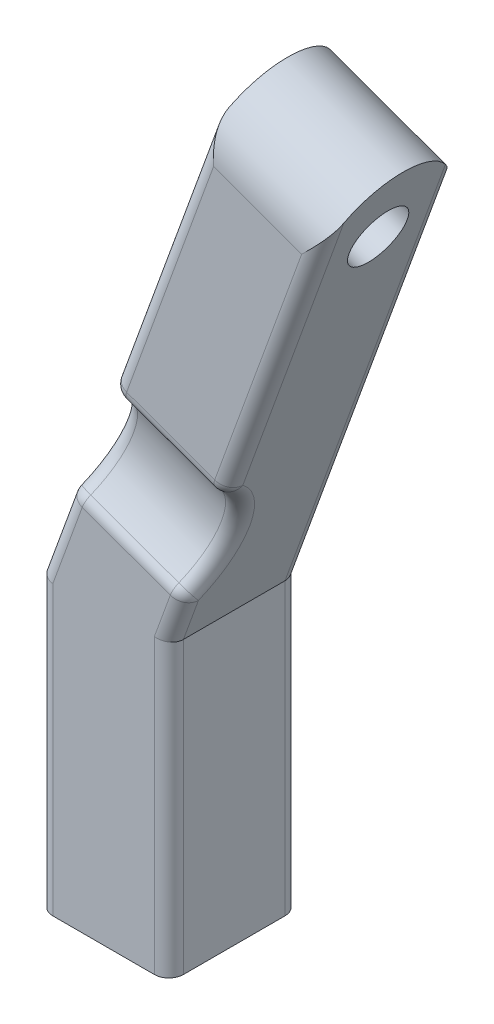
ISO-10303-21;
HEADER;
FILE_DESCRIPTION(('STEP AP214'),'2;1');
FILE_NAME('part.step','',(''),(''),'','','');
FILE_SCHEMA(('AUTOMOTIVE_DESIGN { 1 0 10303 214 1 1 1 1 }'));
ENDSEC;
DATA;
#1=APPLICATION_CONTEXT('core data for automotive mechanical design processes');
#2=APPLICATION_PROTOCOL_DEFINITION('international standard','automotive_design',2000,#1);
#3=PRODUCT_CONTEXT('',#1,'mechanical');
#4=PRODUCT('Part','Part','',(#3));
#5=PRODUCT_RELATED_PRODUCT_CATEGORY('part','',(#4));
#6=PRODUCT_DEFINITION_FORMATION('','',#4);
#7=PRODUCT_DEFINITION_CONTEXT('part definition',#1,'design');
#8=PRODUCT_DEFINITION('design','',#6,#7);
#9=PRODUCT_DEFINITION_SHAPE('','',#8);
#10=(LENGTH_UNIT() NAMED_UNIT(*) SI_UNIT(.MILLI.,.METRE.));
#11=(NAMED_UNIT(*) PLANE_ANGLE_UNIT() SI_UNIT($,.RADIAN.));
#12=(NAMED_UNIT(*) SI_UNIT($,.STERADIAN.) SOLID_ANGLE_UNIT());
#13=UNCERTAINTY_MEASURE_WITH_UNIT(LENGTH_MEASURE(1.E-05),#10,'distance_accuracy_value','');
#14=(GEOMETRIC_REPRESENTATION_CONTEXT(3) GLOBAL_UNCERTAINTY_ASSIGNED_CONTEXT((#13)) GLOBAL_UNIT_ASSIGNED_CONTEXT((#10,
#11,#12)) REPRESENTATION_CONTEXT('',''));
#15=CARTESIAN_POINT('',(0.,0.,0.));
#16=DIRECTION('',(0.,0.,1.));
#17=DIRECTION('',(1.,0.,0.));
#18=AXIS2_PLACEMENT_3D('',#15,#16,#17);
#19=CARTESIAN_POINT('',(0.,0.,9.));
#20=DIRECTION('',(0.,0.,-1.));
#21=DIRECTION('',(-1.,0.,0.));
#22=AXIS2_PLACEMENT_3D('',#19,#20,#21);
#23=PLANE('',#22);
#24=DIRECTION('',(-0.342020143325669,-0.939692620785908,0.));
#25=VECTOR('',#24,1.);
#26=CARTESIAN_POINT('',(-5.4881834760795,1.99753542548456,9.));
#27=LINE('',#26,#25);
#28=CARTESIAN_POINT('',(12.0820868548578,50.2714564134481,9.00000000000001));
#29=VERTEX_POINT('',#28);
#30=CARTESIAN_POINT('',(6.08720428199387,33.8006519122225,9.));
#31=VERTEX_POINT('',#30);
#32=EDGE_CURVE('E239',#29,#31,#27,.T.);
#33=ORIENTED_EDGE('',*,*,#32,.T.);
#34=DIRECTION('',(0.939692620785908,-0.34202014332567,0.));
#35=VECTOR('',#34,1.);
#36=CARTESIAN_POINT('',(11.5753877580734,31.803116486738,9.));
#37=LINE('',#36,#35);
#38=CARTESIAN_POINT('',(12.1550190344574,31.5921479552844,9.));
#39=VERTEX_POINT('',#38);
#40=EDGE_CURVE('E390',#31,#39,#37,.T.);
#41=ORIENTED_EDGE('',*,*,#40,.T.);
#42=DIRECTION('',(0.34202014332567,0.939692620785908,0.));
#43=VECTOR('',#42,1.);
#44=CARTESIAN_POINT('',(0.579631276384077,-0.210968531453531,9.));
#45=LINE('',#44,#43);
#46=CARTESIAN_POINT('',(18.1499016073214,48.06295245651,9.00000000000001));
#47=VERTEX_POINT('',#46);
#48=EDGE_CURVE('E241',#39,#47,#45,.T.);
#49=ORIENTED_EDGE('',*,*,#48,.T.);
#50=DIRECTION('',(0.939692620785908,-0.342020143325669,0.));
#51=VECTOR('',#50,1.);
#52=CARTESIAN_POINT('',(4.99420491631863,52.8512344630694,9.));
#53=LINE('',#52,#51);
#54=EDGE_CURVE('E189',#29,#47,#53,.T.);
#55=ORIENTED_EDGE('',*,*,#54,.F.);
#56=EDGE_LOOP('',(#33,#41,#49,#55));
#57=FACE_BOUND('',#56,.T.);
#58=ADVANCED_FACE('F52',(#57),#23,.F.);
#59=CARTESIAN_POINT('',(0.579631276384081,-0.210968531453532,8.));
#60=DIRECTION('',(0.34202014332567,0.939692620785908,0.));
#61=DIRECTION('',(-0.939692620785908,0.34202014332567,0.));
#62=AXIS2_PLACEMENT_3D('',#59,#60,#61);
#63=CYLINDRICAL_SURFACE('',#62,1.);
#64=ORIENTED_EDGE('',*,*,#48,.F.);
#65=CARTESIAN_POINT('',(12.1550190344574,31.5921479552844,8.));
#66=DIRECTION('',(0.34202014332567,0.939692620785908,0.));
#67=DIRECTION('',(-0.939692620785908,0.34202014332567,0.));
#68=AXIS2_PLACEMENT_3D('',#65,#66,#67);
#69=CIRCLE('',#68,1.);
#70=CARTESIAN_POINT('',(13.0947116552434,31.2501278119588,8.));
#71=VERTEX_POINT('',#70);
#72=EDGE_CURVE('E388',#39,#71,#69,.T.);
#73=ORIENTED_EDGE('',*,*,#72,.T.);
#74=DIRECTION('',(0.34202014332567,0.939692620785908,0.));
#75=VECTOR('',#74,1.);
#76=CARTESIAN_POINT('',(20.6286848730728,51.9495491067209,8.));
#77=LINE('',#76,#75);
#78=CARTESIAN_POINT('',(20.0569732786992,50.378784410739,8.));
#79=VERTEX_POINT('',#78);
#80=EDGE_CURVE('E255',#79,#71,#77,.F.);
#81=ORIENTED_EDGE('',*,*,#80,.F.);
#82=CARTESIAN_POINT('',(20.0569732786992,50.378784410739,8.));
#83=CARTESIAN_POINT('',(20.0377970741125,50.32618437219,8.04525694932147));
#84=CARTESIAN_POINT('',(20.0154365664339,50.2736362015838,8.08910814539003));
#85=CARTESIAN_POINT('',(19.9653490970672,50.1687947661599,8.17373460352773));
#86=CARTESIAN_POINT('',(19.93763247312,50.1165012061111,8.21451558398623));
#87=CARTESIAN_POINT('',(19.8779757189125,50.012504670552,8.2926216928425));
#88=CARTESIAN_POINT('',(19.846068336757,49.9608001873787,8.32997014684788));
#89=CARTESIAN_POINT('',(19.778573462846,49.8575732697211,8.40152630474944));
#90=CARTESIAN_POINT('',(19.7429835574295,49.8060509778213,8.43573192063235));
#91=CARTESIAN_POINT('',(19.6465207030887,49.6724173046542,8.52051490694975));
#92=CARTESIAN_POINT('',(19.5832662995524,49.5904574563704,8.56863531736414));
#93=CARTESIAN_POINT('',(19.4509043475849,49.4270032411482,8.6569408326271));
#94=CARTESIAN_POINT('',(19.3817945240321,49.3455090683974,8.69712283261816));
#95=CARTESIAN_POINT('',(19.2388918225493,49.1825598020291,8.76992408041401));
#96=CARTESIAN_POINT('',(19.1650795437087,49.1011064829517,8.80250901476742));
#97=CARTESIAN_POINT('',(19.0142604341818,48.9385477876584,8.86009231370487));
#98=CARTESIAN_POINT('',(18.9372544102339,48.8574423292161,8.88509258106378));
#99=CARTESIAN_POINT('',(18.7454791596055,48.6586448978246,8.93739310974829));
#100=CARTESIAN_POINT('',(18.6294504498062,48.5410745716638,8.96057647342611));
#101=CARTESIAN_POINT('',(18.3954082443717,48.3064478384059,8.99165072996591));
#102=CARTESIAN_POINT('',(18.2774002358325,48.1893908762592,8.99957852108625));
#103=CARTESIAN_POINT('',(18.156252492378,48.0692504910018,8.99999454091727));
#104=CARTESIAN_POINT('',(18.1530770255399,48.0661014504405,8.99999999503801));
#105=CARTESIAN_POINT('',(18.1499016073213,48.0629524565099,9.));
#106=B_SPLINE_CURVE_WITH_KNOTS('',3,(#82,#83,#84,#85,#86,#87,#88,#89,#90,#91,#92,#93,#94,#95,
#96,#97,#98,#99,#100,#101,#102,#103,#104,#105),.UNSPECIFIED.,.F.,.F.,(4,2,2,2,2,2,2,2,2,2,2,4),
(0.,0.21578260692182,0.431152822075384,0.644930394770693,0.85884898354414,1.20082332099111,
1.54293114720833,1.8865554568414,2.23009348959458,2.72973479565725,3.22816610576653,
3.24158252361186),.UNSPECIFIED.);
#107=EDGE_CURVE('E184',#79,#47,#106,.T.);
#108=ORIENTED_EDGE('',*,*,#107,.T.);
#109=EDGE_LOOP('',(#64,#73,#81,#108));
#110=FACE_BOUND('',#109,.T.);
#111=ADVANCED_FACE('F331',(#110),#63,.T.);
#112=CARTESIAN_POINT('',(-5.4881834760795,1.99753542548456,8.));
#113=DIRECTION('',(-0.342020143325669,-0.939692620785908,0.));
#114=DIRECTION('',(0.939692620785908,-0.342020143325669,0.));
#115=AXIS2_PLACEMENT_3D('',#112,#113,#114);
#116=CYLINDRICAL_SURFACE('',#115,1.);
#117=CARTESIAN_POINT('',(3.0280831213922,25.3957856000936,9.));
#118=VERTEX_POINT('',#117);
#119=CARTESIAN_POINT('',(1.,19.8236730192915,9.));
#120=VERTEX_POINT('',#119);
#121=EDGE_CURVE('E238',#118,#120,#27,.T.);
#122=ORIENTED_EDGE('',*,*,#121,.F.);
#123=CARTESIAN_POINT('',(3.0280831213922,25.3957856000936,8.));
#124=DIRECTION('',(-0.342020143325669,-0.939692620785908,0.));
#125=DIRECTION('',(0.939692620785908,-0.342020143325669,0.));
#126=AXIS2_PLACEMENT_3D('',#123,#124,#125);
#127=CIRCLE('',#126,1.);
#128=CARTESIAN_POINT('',(2.08839050060629,25.7378057434193,8.));
#129=VERTEX_POINT('',#128);
#130=EDGE_CURVE('E373',#118,#129,#127,.T.);
#131=ORIENTED_EDGE('',*,*,#130,.T.);
#132=DIRECTION('',(-0.342020143325669,-0.939692620785908,0.));
#133=VECTOR('',#132,1.);
#134=CARTESIAN_POINT('',(0.,20.,8.));
#135=LINE('',#134,#133);
#136=CARTESIAN_POINT('',(0.,20.,8.));
#137=VERTEX_POINT('',#136);
#138=EDGE_CURVE('E258',#137,#129,#135,.F.);
#139=ORIENTED_EDGE('',*,*,#138,.F.);
#140=CARTESIAN_POINT('',(0.999999999999999,19.8236730192915,8.));
#141=DIRECTION('',(-0.173648177666931,-0.984807753012208,0.));
#142=DIRECTION('',(0.984807753012208,-0.173648177666931,0.));
#143=AXIS2_PLACEMENT_3D('',#140,#141,#142);
#144=ELLIPSE('',#143,1.01542661188575,1.);
#145=EDGE_CURVE('E264',#137,#120,#144,.F.);
#146=ORIENTED_EDGE('',*,*,#145,.T.);
#147=EDGE_LOOP('',(#122,#131,#139,#146));
#148=FACE_BOUND('',#147,.T.);
#149=ADVANCED_FACE('F290',(#148),#116,.T.);
#150=CARTESIAN_POINT('',(20.6286848730728,51.9495491067209,9.));
#151=DIRECTION('',(-0.939692620785908,0.34202014332567,0.));
#152=DIRECTION('',(-0.34202014332567,-0.939692620785908,0.));
#153=AXIS2_PLACEMENT_3D('',#150,#151,#152);
#154=PLANE('',#153);
#155=CARTESIAN_POINT('',(18.9185841564444,47.2510860027914,4.5));
#156=DIRECTION('',(-0.939692620785908,0.34202014332567,0.));
#157=DIRECTION('',(-0.34202014332567,-0.939692620785908,0.));
#158=AXIS2_PLACEMENT_3D('',#155,#156,#157);
#159=CIRCLE('',#158,2.);
#160=CARTESIAN_POINT('',(18.2345438697931,45.3717007612196,4.5));
#161=VERTEX_POINT('',#160);
#162=EDGE_CURVE('E409',#161,#161,#159,.T.);
#163=ORIENTED_EDGE('',*,*,#162,.T.);
#164=EDGE_LOOP('',(#163));
#165=FACE_BOUND('',#164,.T.);
#166=ORIENTED_EDGE('',*,*,#80,.T.);
#167=CARTESIAN_POINT('',(11.5651510749425,27.0476946558943,12.));
#168=DIRECTION('',(-0.939692620785908,0.34202014332567,0.));
#169=DIRECTION('',(-0.34202014332567,-0.939692620785908,0.));
#170=AXIS2_PLACEMENT_3D('',#167,#168,#169);
#171=CIRCLE('',#170,6.);
#172=CARTESIAN_POINT('',(10.0355904946417,22.8452614998299,8.));
#173=VERTEX_POINT('',#172);
#174=EDGE_CURVE('E386',#71,#173,#171,.T.);
#175=ORIENTED_EDGE('',*,*,#174,.T.);
#176=CARTESIAN_POINT('',(9.,20.,8.));
#177=VERTEX_POINT('',#176);
#178=EDGE_CURVE('E254',#173,#177,#77,.F.);
#179=ORIENTED_EDGE('',*,*,#178,.T.);
#180=DIRECTION('',(0.,0.,-1.));
#181=VECTOR('',#180,1.);
#182=CARTESIAN_POINT('',(9.,20.,9.));
#183=LINE('',#182,#181);
#184=CARTESIAN_POINT('',(9.,20.,0.999999999999999));
#185=VERTEX_POINT('',#184);
#186=EDGE_CURVE('E202',#177,#185,#183,.T.);
#187=ORIENTED_EDGE('',*,*,#186,.T.);
#188=DIRECTION('',(0.34202014332567,0.939692620785908,0.));
#189=VECTOR('',#188,1.);
#190=CARTESIAN_POINT('',(20.6286848730728,51.9495491067209,0.999999999999999));
#191=LINE('',#190,#189);
#192=CARTESIAN_POINT('',(20.0569732786992,50.378784410739,0.999999999999999));
#193=VERTEX_POINT('',#192);
#194=EDGE_CURVE('E196',#185,#193,#191,.T.);
#195=ORIENTED_EDGE('',*,*,#194,.T.);
#196=CARTESIAN_POINT('',(19.0895942281073,47.7209323131843,4.5));
#197=DIRECTION('',(0.939692620785908,-0.34202014332567,0.));
#198=DIRECTION('',(0.34202014332567,0.939692620785908,0.));
#199=AXIS2_PLACEMENT_3D('',#196,#197,#198);
#200=CIRCLE('',#199,4.5);
#201=EDGE_CURVE('E177',#193,#79,#200,.T.);
#202=ORIENTED_EDGE('',*,*,#201,.T.);
#203=EDGE_LOOP('',(#166,#175,#179,#187,#195,#202));
#204=FACE_BOUND('',#203,.T.);
#205=ADVANCED_FACE('F200',(#165,#204),#154,.F.);
#206=CARTESIAN_POINT('',(0.,20.,9.));
#207=DIRECTION('',(0.939692620785908,-0.342020143325669,0.));
#208=DIRECTION('',(0.342020143325669,0.939692620785908,0.));
#209=AXIS2_PLACEMENT_3D('',#206,#207,#208);
#210=PLANE('',#209);
#211=CARTESIAN_POINT('',(10.971384162409,50.1436302463808,4.5));
#212=DIRECTION('',(-0.939692620785908,0.342020143325669,0.));
#213=DIRECTION('',(-0.342020143325669,-0.939692620785908,0.));
#214=AXIS2_PLACEMENT_3D('',#211,#212,#213);
#215=CIRCLE('',#214,2.);
#216=CARTESIAN_POINT('',(10.2873438757577,48.264245004809,4.5));
#217=VERTEX_POINT('',#216);
#218=EDGE_CURVE('E405',#217,#217,#215,.T.);
#219=ORIENTED_EDGE('',*,*,#218,.F.);
#220=EDGE_LOOP('',(#219));
#221=FACE_BOUND('',#220,.T.);
#222=ORIENTED_EDGE('',*,*,#138,.T.);
#223=CARTESIAN_POINT('',(3.61795108090713,29.9402388994838,12.));
#224=DIRECTION('',(0.939692620785908,-0.342020143325669,0.));
#225=DIRECTION('',(0.342020143325669,0.939692620785908,0.));
#226=AXIS2_PLACEMENT_3D('',#223,#224,#225);
#227=CIRCLE('',#226,6.);
#228=CARTESIAN_POINT('',(5.14751166120796,34.1426720555482,8.));
#229=VERTEX_POINT('',#228);
#230=EDGE_CURVE('E12',#129,#229,#227,.T.);
#231=ORIENTED_EDGE('',*,*,#230,.T.);
#232=CARTESIAN_POINT('',(12.1097732846638,53.2713286543284,8.));
#233=VERTEX_POINT('',#232);
#234=EDGE_CURVE('E257',#229,#233,#135,.F.);
#235=ORIENTED_EDGE('',*,*,#234,.T.);
#236=CARTESIAN_POINT('',(11.1423942340719,50.6134765567737,4.5));
#237=DIRECTION('',(0.939692620785908,-0.342020143325669,0.));
#238=DIRECTION('',(0.342020143325669,0.939692620785908,0.));
#239=AXIS2_PLACEMENT_3D('',#236,#237,#238);
#240=CIRCLE('',#239,4.5);
#241=CARTESIAN_POINT('',(12.1097732846638,53.2713286543284,1.));
#242=VERTEX_POINT('',#241);
#243=EDGE_CURVE('E650',#242,#233,#240,.T.);
#244=ORIENTED_EDGE('',*,*,#243,.F.);
#245=DIRECTION('',(-0.342020143325669,-0.939692620785908,0.));
#246=VECTOR('',#245,1.);
#247=CARTESIAN_POINT('',(0.,20.,0.999999999999999));
#248=LINE('',#247,#246);
#249=CARTESIAN_POINT('',(0.,20.,0.999999999999999));
#250=VERTEX_POINT('',#249);
#251=EDGE_CURVE('E217',#242,#250,#248,.T.);
#252=ORIENTED_EDGE('',*,*,#251,.T.);
#253=DIRECTION('',(0.,0.,-1.));
#254=VECTOR('',#253,1.);
#255=CARTESIAN_POINT('',(0.,20.,9.));
#256=LINE('',#255,#254);
#257=EDGE_CURVE('E451',#137,#250,#256,.T.);
#258=ORIENTED_EDGE('',*,*,#257,.F.);
#259=EDGE_LOOP('',(#222,#231,#235,#244,#252,#258));
#260=FACE_BOUND('',#259,.T.);
#261=ADVANCED_FACE('F492',(#221,#260),#210,.F.);
#262=CARTESIAN_POINT('',(0.,0.,0.));
#263=DIRECTION('',(0.,0.,-1.));
#264=DIRECTION('',(-1.,0.,0.));
#265=AXIS2_PLACEMENT_3D('',#262,#263,#264);
#266=PLANE('',#265);
#267=DIRECTION('',(-0.342020143325669,-0.939692620785908,0.));
#268=VECTOR('',#267,1.);
#269=CARTESIAN_POINT('',(13.6211774998233,54.5000732069846,0.));
#270=LINE('',#269,#268);
#271=CARTESIAN_POINT('',(1.,19.8236730192915,0.));
#272=VERTEX_POINT('',#271);
#273=CARTESIAN_POINT('',(12.0820868548578,50.2714564134481,0.));
#274=VERTEX_POINT('',#273);
#275=EDGE_CURVE('E207',#272,#274,#270,.F.);
#276=ORIENTED_EDGE('',*,*,#275,.T.);
#277=DIRECTION('',(0.939692620785908,-0.342020143325669,0.));
#278=VECTOR('',#277,1.);
#279=CARTESIAN_POINT('',(4.99420491631864,52.8512344630694,0.));
#280=LINE('',#279,#278);
#281=CARTESIAN_POINT('',(18.1499016073213,48.06295245651,0.));
#282=VERTEX_POINT('',#281);
#283=EDGE_CURVE('E198',#274,#282,#280,.T.);
#284=ORIENTED_EDGE('',*,*,#283,.T.);
#285=DIRECTION('',(0.34202014332567,0.939692620785908,0.));
#286=VECTOR('',#285,1.);
#287=CARTESIAN_POINT('',(8.06030737921409,20.3420201433257,0.));
#288=LINE('',#287,#286);
#289=CARTESIAN_POINT('',(8.,20.1763269807085,0.));
#290=VERTEX_POINT('',#289);
#291=EDGE_CURVE('E197',#282,#290,#288,.F.);
#292=ORIENTED_EDGE('',*,*,#291,.T.);
#293=DIRECTION('',(0.,1.,0.));
#294=VECTOR('',#293,1.);
#295=CARTESIAN_POINT('',(8.,0.,0.));
#296=LINE('',#295,#294);
#297=CARTESIAN_POINT('',(8.,0.,0.));
#298=VERTEX_POINT('',#297);
#299=EDGE_CURVE('E214',#290,#298,#296,.F.);
#300=ORIENTED_EDGE('',*,*,#299,.T.);
#301=DIRECTION('',(1.,0.,0.));
#302=VECTOR('',#301,1.);
#303=CARTESIAN_POINT('',(9.,0.,0.));
#304=LINE('',#303,#302);
#305=CARTESIAN_POINT('',(0.999999999999999,0.,0.));
#306=VERTEX_POINT('',#305);
#307=EDGE_CURVE('E449',#306,#298,#304,.T.);
#308=ORIENTED_EDGE('',*,*,#307,.F.);
#309=DIRECTION('',(0.,-1.,0.));
#310=VECTOR('',#309,1.);
#311=CARTESIAN_POINT('',(1.,20.,0.));
#312=LINE('',#311,#310);
#313=EDGE_CURVE('E204',#306,#272,#312,.F.);
#314=ORIENTED_EDGE('',*,*,#313,.T.);
#315=EDGE_LOOP('',(#276,#284,#292,#300,#308,#314));
#316=FACE_BOUND('',#315,.T.);
#317=ADVANCED_FACE('F425',(#316),#266,.T.);
#318=CARTESIAN_POINT('',(19.6889922522869,52.2915692500465,0.999999999999999));
#319=DIRECTION('',(-0.34202014332567,-0.939692620785908,0.));
#320=DIRECTION('',(0.939692620785908,-0.34202014332567,0.));
#321=AXIS2_PLACEMENT_3D('',#318,#319,#320);
#322=CYLINDRICAL_SURFACE('',#321,1.);
#323=ORIENTED_EDGE('',*,*,#291,.F.);
#324=CARTESIAN_POINT('',(20.0569732786992,50.378784410739,0.999999999999999));
#325=CARTESIAN_POINT('',(20.0377970741125,50.32618437219,0.954743050678535));
#326=CARTESIAN_POINT('',(20.0154365664339,50.2736362015838,0.91089185460998));
#327=CARTESIAN_POINT('',(19.9653490970672,50.1687947661599,0.826265396472295));
#328=CARTESIAN_POINT('',(19.9376324731201,50.1165012061112,0.785484416013793));
#329=CARTESIAN_POINT('',(19.8779757189125,50.012504670552,0.707378307157524));
#330=CARTESIAN_POINT('',(19.846068336757,49.9608001873787,0.670029853152142));
#331=CARTESIAN_POINT('',(19.778573462846,49.8575732697211,0.598473695250576));
#332=CARTESIAN_POINT('',(19.7429835574295,49.8060509778213,0.564268079367651));
#333=CARTESIAN_POINT('',(19.6465207030886,49.6724173046542,0.479485093050242));
#334=CARTESIAN_POINT('',(19.5832662995524,49.5904574563704,0.431364682635849));
#335=CARTESIAN_POINT('',(19.4509043475848,49.4270032411482,0.343059167372885));
#336=CARTESIAN_POINT('',(19.3817945240321,49.3455090683974,0.302877167381828));
#337=CARTESIAN_POINT('',(19.2388918225492,49.182559802029,0.230075919585977));
#338=CARTESIAN_POINT('',(19.1650795437087,49.1011064829517,0.197490985232567));
#339=CARTESIAN_POINT('',(19.0142604341818,48.9385477876584,0.139907686295121));
#340=CARTESIAN_POINT('',(18.9372544102339,48.8574423292162,0.114907418936209));
#341=CARTESIAN_POINT('',(18.7454791596056,48.6586448978246,0.0626068902517147));
#342=CARTESIAN_POINT('',(18.6294504498064,48.5410745716636,0.0394235265738949));
#343=CARTESIAN_POINT('',(18.3954082443715,48.3064478384062,0.00834927003408484));
#344=CARTESIAN_POINT('',(18.2774002358315,48.1893908762602,0.000421478913736042));
#345=CARTESIAN_POINT('',(18.156252492378,48.0692504910019,5.45908272978795E-06));
#346=CARTESIAN_POINT('',(18.1530770255399,48.0661014504406,4.96199342688373E-09));
#347=CARTESIAN_POINT('',(18.1499016073214,48.06295245651,0.));
#348=B_SPLINE_CURVE_WITH_KNOTS('',3,(#324,#325,#326,#327,#328,#329,#330,#331,#332,#333,#334,
#335,#336,#337,#338,#339,#340,#341,#342,#343,#344,#345,#346,#347),.UNSPECIFIED.,.F.,.F.,(4,2,2,
2,2,2,2,2,2,2,2,4),(0.,0.215782606921787,0.431152822075316,0.64493039477065,0.858848983544129,
1.20082332099112,1.54293114720838,1.88655545684142,2.23009348959458,2.7297347956572,
3.22816610576645,3.24158252361179),.UNSPECIFIED.);
#349=EDGE_CURVE('E180',#282,#193,#348,.F.);
#350=ORIENTED_EDGE('',*,*,#349,.T.);
#351=ORIENTED_EDGE('',*,*,#194,.F.);
#352=CARTESIAN_POINT('',(8.,20.1763269807085,0.999999999999999));
#353=DIRECTION('',(-0.173648177666931,-0.984807753012208,0.));
#354=DIRECTION('',(-0.984807753012208,0.17364817766693,0.));
#355=AXIS2_PLACEMENT_3D('',#352,#353,#354);
#356=ELLIPSE('',#355,1.01542661188575,1.);
#357=EDGE_CURVE('E230',#185,#290,#356,.F.);
#358=ORIENTED_EDGE('',*,*,#357,.T.);
#359=EDGE_LOOP('',(#323,#350,#351,#358));
#360=FACE_BOUND('',#359,.T.);
#361=ADVANCED_FACE('F194',(#360),#322,.T.);
#362=CARTESIAN_POINT('',(0.939692620785908,19.6579798566743,0.999999999999999));
#363=DIRECTION('',(0.342020143325669,0.939692620785908,0.));
#364=DIRECTION('',(-0.939692620785908,0.342020143325669,0.));
#365=AXIS2_PLACEMENT_3D('',#362,#363,#364);
#366=CYLINDRICAL_SURFACE('',#365,1.);
#367=ORIENTED_EDGE('',*,*,#251,.F.);
#368=CARTESIAN_POINT('',(12.1097732846638,53.2713286543284,0.999999999999999));
#369=CARTESIAN_POINT('',(12.0906524565791,53.218708460381,0.95474305067854));
#370=CARTESIAN_POINT('',(12.0740042862543,53.16408116901,0.910891854609987));
#371=CARTESIAN_POINT('',(12.0449827381603,53.0515723652854,0.826265396472305));
#372=CARTESIAN_POINT('',(12.0326012514513,52.9936972717436,0.785484416013805));
#373=CARTESIAN_POINT('',(12.0114532919988,52.8756846811362,0.707378307157531));
#374=CARTESIAN_POINT('',(12.0026607636444,52.8155670792098,0.670029853152144));
#375=CARTESIAN_POINT('',(11.9880118530865,52.6931058038906,0.598473695250572));
#376=CARTESIAN_POINT('',(11.9821574115061,52.6307606882523,0.564268079367646));
#377=CARTESIAN_POINT('',(11.9701541756926,52.4663862279437,0.479485093050234));
#378=CARTESIAN_POINT('',(11.9659270850557,52.3629421947559,0.43136468263584));
#379=CARTESIAN_POINT('',(11.962255878545,52.1526483787618,0.343059167372875));
#380=CARTESIAN_POINT('',(11.9628136303366,52.0457972822922,0.302877167381817));
#381=CARTESIAN_POINT('',(11.9675416812852,51.8291148163765,0.230075919585967));
#382=CARTESIAN_POINT('',(11.9717279830542,51.7192723356422,0.197490985232558));
#383=CARTESIAN_POINT('',(11.9827714086421,51.4978004955243,0.139907686295113));
#384=CARTESIAN_POINT('',(11.9896278616095,51.3861715917131,0.114907418936201));
#385=CARTESIAN_POINT('',(12.0087517009449,51.1106131691408,0.062606890251709));
#386=CARTESIAN_POINT('',(12.0220621004056,50.9459672570827,0.0394235265738902));
#387=CARTESIAN_POINT('',(12.0505336742956,50.6157933220665,0.00834927003408772));
#388=CARTESIAN_POINT('',(12.0656902885867,50.4502684009529,0.000421478913745622));
#389=CARTESIAN_POINT('',(12.0812700931881,50.2803632579982,5.45908272928744E-06));
#390=CARTESIAN_POINT('',(12.0816784776584,50.2759098022365,4.96199264969782E-09));
#391=CARTESIAN_POINT('',(12.0820868548578,50.2714564134481,0.));
#392=B_SPLINE_CURVE_WITH_KNOTS('',3,(#368,#369,#370,#371,#372,#373,#374,#375,#376,#377,#378,
#379,#380,#381,#382,#383,#384,#385,#386,#387,#388,#389,#390,#391),.UNSPECIFIED.,.F.,.F.,(4,2,2,
2,2,2,2,2,2,2,2,4),(0.,0.215782606921785,0.431152822075306,0.644930394770661,0.858848983544151,
1.20082332099116,1.54293114720842,1.88655545684146,2.23009348959463,2.72973479565722,
3.22816610576645,3.24158252361177),.UNSPECIFIED.);
#393=EDGE_CURVE('E274',#242,#274,#392,.T.);
#394=ORIENTED_EDGE('',*,*,#393,.T.);
#395=ORIENTED_EDGE('',*,*,#275,.F.);
#396=CARTESIAN_POINT('',(1.,19.8236730192915,0.999999999999999));
#397=DIRECTION('',(0.173648177666931,0.984807753012208,0.));
#398=DIRECTION('',(-0.984807753012208,0.173648177666931,0.));
#399=AXIS2_PLACEMENT_3D('',#396,#397,#398);
#400=ELLIPSE('',#399,1.01542661188575,1.);
#401=EDGE_CURVE('E233',#272,#250,#400,.T.);
#402=ORIENTED_EDGE('',*,*,#401,.T.);
#403=EDGE_LOOP('',(#367,#394,#395,#402));
#404=FACE_BOUND('',#403,.T.);
#405=ADVANCED_FACE('F342',(#404),#366,.T.);
#406=CARTESIAN_POINT('',(8.,20.1763269807085,9.));
#407=VERTEX_POINT('',#406);
#408=CARTESIAN_POINT('',(9.09589787385577,23.1872816431555,9.));
#409=VERTEX_POINT('',#408);
#410=EDGE_CURVE('E242',#407,#409,#45,.T.);
#411=ORIENTED_EDGE('',*,*,#410,.T.);
#412=DIRECTION('',(0.939692620785908,-0.34202014332567,0.));
#413=VECTOR('',#412,1.);
#414=CARTESIAN_POINT('',(8.5162665974717,23.3982501746091,9.));
#415=LINE('',#414,#413);
#416=EDGE_CURVE('E353',#409,#118,#415,.F.);
#417=ORIENTED_EDGE('',*,*,#416,.T.);
#418=ORIENTED_EDGE('',*,*,#121,.T.);
#419=DIRECTION('',(0.,-1.,0.));
#420=VECTOR('',#419,1.);
#421=CARTESIAN_POINT('',(1.,0.,9.));
#422=LINE('',#421,#420);
#423=CARTESIAN_POINT('',(0.999999999999999,0.,9.));
#424=VERTEX_POINT('',#423);
#425=EDGE_CURVE('E229',#120,#424,#422,.T.);
#426=ORIENTED_EDGE('',*,*,#425,.T.);
#427=DIRECTION('',(1.,0.,0.));
#428=VECTOR('',#427,1.);
#429=CARTESIAN_POINT('',(9.,0.,9.));
#430=LINE('',#429,#428);
#431=CARTESIAN_POINT('',(8.,0.,9.));
#432=VERTEX_POINT('',#431);
#433=EDGE_CURVE('E445',#424,#432,#430,.T.);
#434=ORIENTED_EDGE('',*,*,#433,.T.);
#435=DIRECTION('',(0.,1.,0.));
#436=VECTOR('',#435,1.);
#437=CARTESIAN_POINT('',(8.,0.,9.));
#438=LINE('',#437,#436);
#439=EDGE_CURVE('E245',#432,#407,#438,.T.);
#440=ORIENTED_EDGE('',*,*,#439,.T.);
#441=EDGE_LOOP('',(#411,#417,#418,#426,#434,#440));
#442=FACE_BOUND('',#441,.T.);
#443=ADVANCED_FACE('F334',(#442),#23,.F.);
#444=ORIENTED_EDGE('',*,*,#178,.F.);
#445=CARTESIAN_POINT('',(9.09589787385577,23.1872816431555,8.));
#446=DIRECTION('',(0.34202014332567,0.939692620785908,0.));
#447=DIRECTION('',(-0.939692620785908,0.34202014332567,0.));
#448=AXIS2_PLACEMENT_3D('',#445,#446,#447);
#449=CIRCLE('',#448,1.);
#450=EDGE_CURVE('E361',#173,#409,#449,.F.);
#451=ORIENTED_EDGE('',*,*,#450,.T.);
#452=ORIENTED_EDGE('',*,*,#410,.F.);
#453=CARTESIAN_POINT('',(8.,20.1763269807085,8.));
#454=DIRECTION('',(0.173648177666931,0.984807753012208,0.));
#455=DIRECTION('',(-0.984807753012208,0.17364817766693,0.));
#456=AXIS2_PLACEMENT_3D('',#453,#454,#455);
#457=ELLIPSE('',#456,1.01542661188575,1.);
#458=EDGE_CURVE('E236',#177,#407,#457,.F.);
#459=ORIENTED_EDGE('',*,*,#458,.F.);
#460=EDGE_LOOP('',(#444,#451,#452,#459));
#461=FACE_BOUND('',#460,.T.);
#462=ADVANCED_FACE('F289',(#461),#63,.T.);
#463=ORIENTED_EDGE('',*,*,#234,.F.);
#464=CARTESIAN_POINT('',(6.08720428199386,33.8006519122225,8.));
#465=DIRECTION('',(-0.342020143325669,-0.939692620785908,0.));
#466=DIRECTION('',(0.939692620785908,-0.342020143325669,0.));
#467=AXIS2_PLACEMENT_3D('',#464,#465,#466);
#468=CIRCLE('',#467,1.);
#469=EDGE_CURVE('E61',#229,#31,#468,.F.);
#470=ORIENTED_EDGE('',*,*,#469,.T.);
#471=ORIENTED_EDGE('',*,*,#32,.F.);
#472=CARTESIAN_POINT('',(12.1097732846638,53.2713286543285,8.));
#473=CARTESIAN_POINT('',(12.0906524565791,53.218708460381,8.04525694932147));
#474=CARTESIAN_POINT('',(12.0740042862543,53.16408116901,8.08910814539003));
#475=CARTESIAN_POINT('',(12.0449827381603,53.0515723652854,8.17373460352773));
#476=CARTESIAN_POINT('',(12.0326012514513,52.9936972717435,8.21451558398624));
#477=CARTESIAN_POINT('',(12.0114532919988,52.8756846811361,8.29262169284251));
#478=CARTESIAN_POINT('',(12.0026607636444,52.8155670792097,8.32997014684789));
#479=CARTESIAN_POINT('',(11.9880118530865,52.6931058038905,8.40152630474944));
#480=CARTESIAN_POINT('',(11.9821574115061,52.6307606882523,8.43573192063236));
#481=CARTESIAN_POINT('',(11.9701541756926,52.4663862279438,8.52051490694976));
#482=CARTESIAN_POINT('',(11.9659270850557,52.3629421947559,8.56863531736414));
#483=CARTESIAN_POINT('',(11.962255878545,52.1526483787619,8.6569408326271));
#484=CARTESIAN_POINT('',(11.9628136303366,52.0457972822923,8.69712283261816));
#485=CARTESIAN_POINT('',(11.9675416812852,51.8291148163765,8.76992408041402));
#486=CARTESIAN_POINT('',(11.9717279830542,51.7192723356423,8.80250901476743));
#487=CARTESIAN_POINT('',(11.982771408642,51.4978004955243,8.86009231370488));
#488=CARTESIAN_POINT('',(11.9896278616094,51.3861715917131,8.88509258106379));
#489=CARTESIAN_POINT('',(12.0087517009451,51.1106131691408,8.93739310974829));
#490=CARTESIAN_POINT('',(12.0220621004063,50.9459672570827,8.96057647342611));
#491=CARTESIAN_POINT('',(12.050533674295,50.6157933220664,8.99165072996591));
#492=CARTESIAN_POINT('',(12.0656902885842,50.4502684009527,8.99957852108625));
#493=CARTESIAN_POINT('',(12.081270093188,50.2803632579982,8.99999454091727));
#494=CARTESIAN_POINT('',(12.0816784776584,50.2759098022365,8.99999999503801));
#495=CARTESIAN_POINT('',(12.0820868548578,50.2714564134481,9.));
#496=B_SPLINE_CURVE_WITH_KNOTS('',3,(#472,#473,#474,#475,#476,#477,#478,#479,#480,#481,#482,
#483,#484,#485,#486,#487,#488,#489,#490,#491,#492,#493,#494,#495),.UNSPECIFIED.,.F.,.F.,(4,2,2,
2,2,2,2,2,2,2,2,4),(0.,0.215782606921835,0.431152822075412,0.644930394770713,0.858848983544156,
1.20082332099112,1.54293114720835,1.88655545684143,2.23009348959463,2.72973479565722,
3.22816610576644,3.24158252361179),.UNSPECIFIED.);
#497=EDGE_CURVE('E262',#29,#233,#496,.F.);
#498=ORIENTED_EDGE('',*,*,#497,.T.);
#499=EDGE_LOOP('',(#463,#470,#471,#498));
#500=FACE_BOUND('',#499,.T.);
#501=ADVANCED_FACE('F283',(#500),#116,.T.);
#502=CARTESIAN_POINT('',(9.,0.,9.));
#503=DIRECTION('',(0.,1.,0.));
#504=DIRECTION('',(-1.,0.,0.));
#505=AXIS2_PLACEMENT_3D('',#502,#503,#504);
#506=PLANE('',#505);
#507=CARTESIAN_POINT('',(4.5,0.,4.5));
#508=DIRECTION('',(0.,-1.,0.));
#509=DIRECTION('',(1.,0.,0.));
#510=AXIS2_PLACEMENT_3D('',#507,#508,#509);
#511=CIRCLE('',#510,2.5);
#512=CARTESIAN_POINT('',(7.,0.,4.5));
#513=VERTEX_POINT('',#512);
#514=EDGE_CURVE('E232',#513,#513,#511,.T.);
#515=ORIENTED_EDGE('',*,*,#514,.F.);
#516=EDGE_LOOP('',(#515));
#517=FACE_BOUND('',#516,.T.);
#518=DIRECTION('',(0.,0.,-1.));
#519=VECTOR('',#518,1.);
#520=CARTESIAN_POINT('',(9.,0.,9.));
#521=LINE('',#520,#519);
#522=CARTESIAN_POINT('',(9.,0.,8.));
#523=VERTEX_POINT('',#522);
#524=CARTESIAN_POINT('',(9.,0.,0.999999999999999));
#525=VERTEX_POINT('',#524);
#526=EDGE_CURVE('E205',#523,#525,#521,.T.);
#527=ORIENTED_EDGE('',*,*,#526,.F.);
#528=CARTESIAN_POINT('',(8.,0.,8.));
#529=DIRECTION('',(0.,1.,0.));
#530=DIRECTION('',(-1.,0.,0.));
#531=AXIS2_PLACEMENT_3D('',#528,#529,#530);
#532=CIRCLE('',#531,1.);
#533=EDGE_CURVE('E252',#523,#432,#532,.F.);
#534=ORIENTED_EDGE('',*,*,#533,.T.);
#535=ORIENTED_EDGE('',*,*,#433,.F.);
#536=CARTESIAN_POINT('',(1.,0.,8.));
#537=DIRECTION('',(0.,1.,0.));
#538=DIRECTION('',(-1.,0.,0.));
#539=AXIS2_PLACEMENT_3D('',#536,#537,#538);
#540=CIRCLE('',#539,1.);
#541=CARTESIAN_POINT('',(0.,0.,8.));
#542=VERTEX_POINT('',#541);
#543=EDGE_CURVE('E250',#424,#542,#540,.F.);
#544=ORIENTED_EDGE('',*,*,#543,.T.);
#545=DIRECTION('',(0.,0.,-1.));
#546=VECTOR('',#545,1.);
#547=CARTESIAN_POINT('',(0.,0.,9.));
#548=LINE('',#547,#546);
#549=CARTESIAN_POINT('',(0.,0.,0.999999999999999));
#550=VERTEX_POINT('',#549);
#551=EDGE_CURVE('E448',#542,#550,#548,.T.);
#552=ORIENTED_EDGE('',*,*,#551,.T.);
#553=CARTESIAN_POINT('',(1.,0.,0.999999999999999));
#554=DIRECTION('',(0.,1.,0.));
#555=DIRECTION('',(-1.,0.,0.));
#556=AXIS2_PLACEMENT_3D('',#553,#554,#555);
#557=CIRCLE('',#556,1.);
#558=EDGE_CURVE('E221',#550,#306,#557,.F.);
#559=ORIENTED_EDGE('',*,*,#558,.T.);
#560=ORIENTED_EDGE('',*,*,#307,.T.);
#561=CARTESIAN_POINT('',(8.,0.,0.999999999999999));
#562=DIRECTION('',(0.,1.,0.));
#563=DIRECTION('',(-1.,0.,0.));
#564=AXIS2_PLACEMENT_3D('',#561,#562,#563);
#565=CIRCLE('',#564,1.);
#566=EDGE_CURVE('E223',#298,#525,#565,.F.);
#567=ORIENTED_EDGE('',*,*,#566,.T.);
#568=EDGE_LOOP('',(#527,#534,#535,#544,#552,#559,#560,#567));
#569=FACE_BOUND('',#568,.T.);
#570=ADVANCED_FACE('F288',(#517,#569),#506,.F.);
#571=CARTESIAN_POINT('',(9.,20.,9.));
#572=DIRECTION('',(-1.,0.,0.));
#573=DIRECTION('',(0.,-1.,0.));
#574=AXIS2_PLACEMENT_3D('',#571,#572,#573);
#575=PLANE('',#574);
#576=ORIENTED_EDGE('',*,*,#186,.F.);
#577=DIRECTION('',(0.,1.,0.));
#578=VECTOR('',#577,1.);
#579=CARTESIAN_POINT('',(9.,20.,8.));
#580=LINE('',#579,#578);
#581=EDGE_CURVE('E248',#177,#523,#580,.F.);
#582=ORIENTED_EDGE('',*,*,#581,.T.);
#583=ORIENTED_EDGE('',*,*,#526,.T.);
#584=DIRECTION('',(0.,1.,0.));
#585=VECTOR('',#584,1.);
#586=CARTESIAN_POINT('',(9.,20.,0.999999999999999));
#587=LINE('',#586,#585);
#588=EDGE_CURVE('E219',#525,#185,#587,.T.);
#589=ORIENTED_EDGE('',*,*,#588,.T.);
#590=EDGE_LOOP('',(#576,#582,#583,#589));
#591=FACE_BOUND('',#590,.T.);
#592=ADVANCED_FACE('F480',(#591),#575,.F.);
#593=CARTESIAN_POINT('',(0.,0.,9.));
#594=DIRECTION('',(1.,0.,0.));
#595=DIRECTION('',(0.,0.,-1.));
#596=AXIS2_PLACEMENT_3D('',#593,#594,#595);
#597=PLANE('',#596);
#598=ORIENTED_EDGE('',*,*,#551,.F.);
#599=DIRECTION('',(0.,-1.,0.));
#600=VECTOR('',#599,1.);
#601=CARTESIAN_POINT('',(0.,0.,8.));
#602=LINE('',#601,#600);
#603=EDGE_CURVE('E260',#542,#137,#602,.F.);
#604=ORIENTED_EDGE('',*,*,#603,.T.);
#605=ORIENTED_EDGE('',*,*,#257,.T.);
#606=DIRECTION('',(0.,-1.,0.));
#607=VECTOR('',#606,1.);
#608=CARTESIAN_POINT('',(0.,0.,0.999999999999999));
#609=LINE('',#608,#607);
#610=EDGE_CURVE('E226',#250,#550,#609,.T.);
#611=ORIENTED_EDGE('',*,*,#610,.T.);
#612=EDGE_LOOP('',(#598,#604,#605,#611));
#613=FACE_BOUND('',#612,.T.);
#614=ADVANCED_FACE('F463',(#613),#597,.F.);
#615=CARTESIAN_POINT('',(4.5,15.,4.5));
#616=DIRECTION('',(0.,-1.,0.));
#617=DIRECTION('',(1.,0.,0.));
#618=AXIS2_PLACEMENT_3D('',#615,#616,#617);
#619=CYLINDRICAL_SURFACE('',#618,2.5);
#620=CARTESIAN_POINT('',(4.5,15.,4.5));
#621=DIRECTION('',(0.,-1.,0.));
#622=DIRECTION('',(1.,0.,0.));
#623=AXIS2_PLACEMENT_3D('',#620,#621,#622);
#624=CIRCLE('',#623,2.5);
#625=CARTESIAN_POINT('',(7.,15.,4.5));
#626=VERTEX_POINT('',#625);
#627=EDGE_CURVE('E454',#626,#626,#624,.T.);
#628=ORIENTED_EDGE('',*,*,#627,.F.);
#629=EDGE_LOOP('',(#628));
#630=FACE_BOUND('',#629,.T.);
#631=ORIENTED_EDGE('',*,*,#514,.T.);
#632=EDGE_LOOP('',(#631));
#633=FACE_BOUND('',#632,.T.);
#634=ADVANCED_FACE('F486',(#630,#633),#619,.F.);
#635=CARTESIAN_POINT('',(4.5,15.,4.5));
#636=DIRECTION('',(0.,-1.,0.));
#637=DIRECTION('',(1.,0.,0.));
#638=AXIS2_PLACEMENT_3D('',#635,#636,#637);
#639=PLANE('',#638);
#640=ORIENTED_EDGE('',*,*,#627,.T.);
#641=EDGE_LOOP('',(#640));
#642=FACE_BOUND('',#641,.T.);
#643=ADVANCED_FACE('F430',(#642),#639,.T.);
#644=CARTESIAN_POINT('',(8.,20.,0.999999999999999));
#645=DIRECTION('',(0.,-1.,0.));
#646=DIRECTION('',(1.,0.,0.));
#647=AXIS2_PLACEMENT_3D('',#644,#645,#646);
#648=CYLINDRICAL_SURFACE('',#647,1.);
#649=ORIENTED_EDGE('',*,*,#566,.F.);
#650=ORIENTED_EDGE('',*,*,#299,.F.);
#651=ORIENTED_EDGE('',*,*,#357,.F.);
#652=ORIENTED_EDGE('',*,*,#588,.F.);
#653=EDGE_LOOP('',(#649,#650,#651,#652));
#654=FACE_BOUND('',#653,.T.);
#655=ADVANCED_FACE('F427',(#654),#648,.T.);
#656=CARTESIAN_POINT('',(1.,0.,0.999999999999999));
#657=DIRECTION('',(0.,1.,0.));
#658=DIRECTION('',(0.,0.,1.));
#659=AXIS2_PLACEMENT_3D('',#656,#657,#658);
#660=CYLINDRICAL_SURFACE('',#659,1.);
#661=ORIENTED_EDGE('',*,*,#558,.F.);
#662=ORIENTED_EDGE('',*,*,#610,.F.);
#663=ORIENTED_EDGE('',*,*,#401,.F.);
#664=ORIENTED_EDGE('',*,*,#313,.F.);
#665=EDGE_LOOP('',(#661,#662,#663,#664));
#666=FACE_BOUND('',#665,.T.);
#667=ADVANCED_FACE('F429',(#666),#660,.T.);
#668=CARTESIAN_POINT('',(8.,0.,8.));
#669=DIRECTION('',(0.,1.,0.));
#670=DIRECTION('',(-1.,0.,0.));
#671=AXIS2_PLACEMENT_3D('',#668,#669,#670);
#672=CYLINDRICAL_SURFACE('',#671,1.);
#673=ORIENTED_EDGE('',*,*,#533,.F.);
#674=ORIENTED_EDGE('',*,*,#581,.F.);
#675=ORIENTED_EDGE('',*,*,#458,.T.);
#676=ORIENTED_EDGE('',*,*,#439,.F.);
#677=EDGE_LOOP('',(#673,#674,#675,#676));
#678=FACE_BOUND('',#677,.T.);
#679=ADVANCED_FACE('F296',(#678),#672,.T.);
#680=CARTESIAN_POINT('',(1.,0.,8.));
#681=DIRECTION('',(0.,-1.,0.));
#682=DIRECTION('',(0.,0.,-1.));
#683=AXIS2_PLACEMENT_3D('',#680,#681,#682);
#684=CYLINDRICAL_SURFACE('',#683,1.);
#685=ORIENTED_EDGE('',*,*,#543,.F.);
#686=ORIENTED_EDGE('',*,*,#425,.F.);
#687=ORIENTED_EDGE('',*,*,#145,.F.);
#688=ORIENTED_EDGE('',*,*,#603,.F.);
#689=EDGE_LOOP('',(#685,#686,#687,#688));
#690=FACE_BOUND('',#689,.T.);
#691=ADVANCED_FACE('F293',(#690),#684,.T.);
#692=CARTESIAN_POINT('',(4.99420491631863,52.8512344630694,4.5));
#693=DIRECTION('',(0.939692620785908,-0.342020143325669,0.));
#694=DIRECTION('',(0.34202014332567,0.939692620785908,0.));
#695=AXIS2_PLACEMENT_3D('',#692,#693,#694);
#696=CYLINDRICAL_SURFACE('',#695,4.5);
#697=ORIENTED_EDGE('',*,*,#201,.F.);
#698=ORIENTED_EDGE('',*,*,#349,.F.);
#699=ORIENTED_EDGE('',*,*,#283,.F.);
#700=ORIENTED_EDGE('',*,*,#393,.F.);
#701=ORIENTED_EDGE('',*,*,#243,.T.);
#702=ORIENTED_EDGE('',*,*,#497,.F.);
#703=ORIENTED_EDGE('',*,*,#54,.T.);
#704=ORIENTED_EDGE('',*,*,#107,.F.);
#705=EDGE_LOOP('',(#697,#698,#699,#700,#701,#702,#703,#704));
#706=FACE_BOUND('',#705,.T.);
#707=ADVANCED_FACE('F179',(#706),#696,.T.);
#708=CARTESIAN_POINT('',(25.0667734741976,45.0133280964958,4.5));
#709=DIRECTION('',(-0.939692620785908,0.342020143325669,0.));
#710=DIRECTION('',(-0.342020143325669,-0.939692620785908,0.));
#711=AXIS2_PLACEMENT_3D('',#708,#709,#710);
#712=CYLINDRICAL_SURFACE('',#711,2.);
#713=ORIENTED_EDGE('',*,*,#218,.T.);
#714=EDGE_LOOP('',(#713));
#715=FACE_BOUND('',#714,.T.);
#716=ORIENTED_EDGE('',*,*,#162,.F.);
#717=EDGE_LOOP('',(#716));
#718=FACE_BOUND('',#717,.T.);
#719=ADVANCED_FACE('F521',(#715,#718),#712,.F.);
#720=CARTESIAN_POINT('',(2.16822486708344,30.467896089151,12.));
#721=DIRECTION('',(0.939692620785908,-0.34202014332567,0.));
#722=DIRECTION('',(0.34202014332567,0.939692620785908,0.));
#723=AXIS2_PLACEMENT_3D('',#720,#721,#722);
#724=CYLINDRICAL_SURFACE('',#723,5.);
#725=CARTESIAN_POINT('',(4.55764370169303,29.5982187561581,12.));
#726=DIRECTION('',(0.939692620785908,-0.342020143325669,0.));
#727=DIRECTION('',(0.342020143325669,0.939692620785908,0.));
#728=AXIS2_PLACEMENT_3D('',#725,#726,#727);
#729=CIRCLE('',#728,5.);
#730=CARTESIAN_POINT('',(5.8322775186104,33.1002463862118,8.66666666666666));
#731=VERTEX_POINT('',#730);
#732=CARTESIAN_POINT('',(3.28300988477567,26.0961911261044,8.66666666666667));
#733=VERTEX_POINT('',#732);
#734=EDGE_CURVE('E372',#731,#733,#729,.F.);
#735=ORIENTED_EDGE('',*,*,#734,.T.);
#736=DIRECTION('',(0.939692620785908,-0.34202014332567,0.));
#737=VECTOR('',#736,1.);
#738=CARTESIAN_POINT('',(0.893591050166077,26.9658684590973,8.66666666666667));
#739=LINE('',#738,#737);
#740=CARTESIAN_POINT('',(9.35082463723925,23.8876871691663,8.66666666666667));
#741=VERTEX_POINT('',#740);
#742=EDGE_CURVE('E382',#733,#741,#739,.T.);
#743=ORIENTED_EDGE('',*,*,#742,.T.);
#744=CARTESIAN_POINT('',(10.6254584541566,27.38971479922,12.));
#745=DIRECTION('',(-0.939692620785908,0.34202014332567,0.));
#746=DIRECTION('',(-0.34202014332567,-0.939692620785908,0.));
#747=AXIS2_PLACEMENT_3D('',#744,#745,#746);
#748=CIRCLE('',#747,5.);
#749=CARTESIAN_POINT('',(11.900092271074,30.8917424292737,8.66666666666667));
#750=VERTEX_POINT('',#749);
#751=EDGE_CURVE('E380',#741,#750,#748,.F.);
#752=ORIENTED_EDGE('',*,*,#751,.T.);
#753=DIRECTION('',(0.939692620785908,-0.34202014332567,0.));
#754=VECTOR('',#753,1.);
#755=CARTESIAN_POINT('',(3.44285868400081,33.9699237192047,8.66666666666667));
#756=LINE('',#755,#754);
#757=EDGE_CURVE('E375',#750,#731,#756,.F.);
#758=ORIENTED_EDGE('',*,*,#757,.T.);
#759=EDGE_LOOP('',(#735,#743,#752,#758));
#760=FACE_BOUND('',#759,.T.);
#761=ADVANCED_FACE('F327',(#760),#724,.F.);
#762=CARTESIAN_POINT('',(12.1550190344574,31.5921479552844,8.));
#763=DIRECTION('',(0.254926763383472,0.700405526010741,-0.666666666666667));
#764=DIRECTION('',(0.,0.689445701779424,0.724337369115992));
#765=AXIS2_PLACEMENT_3D('',#762,#763,#764);
#766=SPHERICAL_SURFACE('',#765,1.);
#767=CARTESIAN_POINT('',(12.1550190344575,31.5921479552844,8.));
#768=DIRECTION('',(-0.228013428883787,-0.626461747190596,-0.745355992499935));
#769=DIRECTION('',(0.,0.765521366040165,-0.643410474064573));
#770=AXIS2_PLACEMENT_3D('',#767,#768,#769);
#771=CIRCLE('',#770,1.);
#772=EDGE_CURVE('E400',#71,#750,#771,.T.);
#773=ORIENTED_EDGE('',*,*,#772,.F.);
#774=ORIENTED_EDGE('',*,*,#72,.F.);
#775=CARTESIAN_POINT('',(12.1550190344574,31.5921479552844,8.));
#776=DIRECTION('',(-0.939692620785909,0.342020143325666,0.));
#777=DIRECTION('',(-0.342020143325666,-0.939692620785909,0.));
#778=AXIS2_PLACEMENT_3D('',#775,#776,#777);
#779=CIRCLE('',#778,1.);
#780=EDGE_CURVE('E56',#750,#39,#779,.T.);
#781=ORIENTED_EDGE('',*,*,#780,.F.);
#782=EDGE_LOOP('',(#773,#774,#781));
#783=FACE_BOUND('',#782,.T.);
#784=ADVANCED_FACE('F54',(#783),#766,.T.);
#785=CARTESIAN_POINT('',(3.69778544738428,34.6703292452155,8.));
#786=DIRECTION('',(0.939692620785908,-0.34202014332567,0.));
#787=DIRECTION('',(0.34202014332567,0.939692620785908,0.));
#788=AXIS2_PLACEMENT_3D('',#785,#786,#787);
#789=CYLINDRICAL_SURFACE('',#788,1.);
#790=ORIENTED_EDGE('',*,*,#780,.T.);
#791=ORIENTED_EDGE('',*,*,#40,.F.);
#792=CARTESIAN_POINT('',(6.08720428199388,33.8006519122225,8.));
#793=DIRECTION('',(-0.939692620785909,0.342020143325668,0.));
#794=DIRECTION('',(-0.342020143325668,-0.939692620785909,0.));
#795=AXIS2_PLACEMENT_3D('',#792,#793,#794);
#796=CIRCLE('',#795,1.);
#797=EDGE_CURVE('E398',#731,#31,#796,.T.);
#798=ORIENTED_EDGE('',*,*,#797,.F.);
#799=ORIENTED_EDGE('',*,*,#757,.F.);
#800=EDGE_LOOP('',(#790,#791,#798,#799));
#801=FACE_BOUND('',#800,.T.);
#802=ADVANCED_FACE('F320',(#801),#789,.T.);
#803=CARTESIAN_POINT('',(10.6254584541566,27.38971479922,12.));
#804=DIRECTION('',(-0.939692620785908,0.34202014332567,0.));
#805=DIRECTION('',(-0.34202014332567,-0.939692620785908,0.));
#806=AXIS2_PLACEMENT_3D('',#803,#804,#805);
#807=TOROIDAL_SURFACE('',#806,6.,1.);
#808=ORIENTED_EDGE('',*,*,#772,.T.);
#809=ORIENTED_EDGE('',*,*,#751,.F.);
#810=CARTESIAN_POINT('',(9.09589787385578,23.1872816431555,8.00000000000001));
#811=DIRECTION('',(-0.228013428883779,-0.626461747190604,0.745355992499932));
#812=DIRECTION('',(0.,-0.76552136604016,-0.64341047406458));
#813=AXIS2_PLACEMENT_3D('',#810,#811,#812);
#814=CIRCLE('',#813,1.);
#815=EDGE_CURVE('E363',#173,#741,#814,.T.);
#816=ORIENTED_EDGE('',*,*,#815,.F.);
#817=ORIENTED_EDGE('',*,*,#174,.F.);
#818=EDGE_LOOP('',(#808,#809,#816,#817));
#819=FACE_BOUND('',#818,.T.);
#820=ADVANCED_FACE('F317',(#819),#807,.T.);
#821=CARTESIAN_POINT('',(6.08720428199387,33.8006519122225,8.));
#822=DIRECTION('',(0.254926763383472,0.70040552601074,-0.666666666666668));
#823=DIRECTION('',(0.,0.689445701779425,0.724337369115992));
#824=AXIS2_PLACEMENT_3D('',#821,#822,#823);
#825=SPHERICAL_SURFACE('',#824,1.);
#826=ORIENTED_EDGE('',*,*,#797,.T.);
#827=ORIENTED_EDGE('',*,*,#469,.F.);
#828=CARTESIAN_POINT('',(6.08720428199387,33.8006519122225,7.99999999999999));
#829=DIRECTION('',(-0.228013428883779,-0.626461747190606,-0.74535599249993));
#830=DIRECTION('',(0.,0.765521366040159,-0.643410474064582));
#831=AXIS2_PLACEMENT_3D('',#828,#829,#830);
#832=CIRCLE('',#831,1.);
#833=EDGE_CURVE('E366',#731,#229,#832,.T.);
#834=ORIENTED_EDGE('',*,*,#833,.F.);
#835=EDGE_LOOP('',(#826,#827,#834));
#836=FACE_BOUND('',#835,.T.);
#837=ADVANCED_FACE('F313',(#836),#825,.T.);
#838=CARTESIAN_POINT('',(9.09589787385578,23.1872816431555,8.));
#839=DIRECTION('',(-0.254926763383473,-0.700405526010741,-0.666666666666666));
#840=DIRECTION('',(0.,0.689445701779423,-0.724337369115993));
#841=AXIS2_PLACEMENT_3D('',#838,#839,#840);
#842=SPHERICAL_SURFACE('',#841,1.);
#843=ORIENTED_EDGE('',*,*,#450,.F.);
#844=ORIENTED_EDGE('',*,*,#815,.T.);
#845=CARTESIAN_POINT('',(9.09589787385578,23.1872816431555,8.));
#846=DIRECTION('',(-0.939692620785906,0.342020143325675,0.));
#847=DIRECTION('',(-0.342020143325675,-0.939692620785906,0.));
#848=AXIS2_PLACEMENT_3D('',#845,#846,#847);
#849=CIRCLE('',#848,1.);
#850=EDGE_CURVE('E360',#409,#741,#849,.T.);
#851=ORIENTED_EDGE('',*,*,#850,.F.);
#852=EDGE_LOOP('',(#843,#844,#851));
#853=FACE_BOUND('',#852,.T.);
#854=ADVANCED_FACE('F309',(#853),#842,.T.);
#855=CARTESIAN_POINT('',(4.55764370169303,29.5982187561581,12.));
#856=DIRECTION('',(0.939692620785908,-0.342020143325669,0.));
#857=DIRECTION('',(0.342020143325669,0.939692620785908,0.));
#858=AXIS2_PLACEMENT_3D('',#855,#856,#857);
#859=TOROIDAL_SURFACE('',#858,6.,1.);
#860=ORIENTED_EDGE('',*,*,#833,.T.);
#861=ORIENTED_EDGE('',*,*,#230,.F.);
#862=CARTESIAN_POINT('',(3.0280831213922,25.3957856000936,8.00000000000001));
#863=DIRECTION('',(-0.22801342888378,-0.626461747190604,0.745355992499931));
#864=DIRECTION('',(0.,-0.76552136604016,-0.64341047406458));
#865=AXIS2_PLACEMENT_3D('',#862,#863,#864);
#866=CIRCLE('',#865,1.);
#867=EDGE_CURVE('E367',#733,#129,#866,.T.);
#868=ORIENTED_EDGE('',*,*,#867,.F.);
#869=ORIENTED_EDGE('',*,*,#734,.F.);
#870=EDGE_LOOP('',(#860,#861,#868,#869));
#871=FACE_BOUND('',#870,.T.);
#872=ADVANCED_FACE('F305',(#871),#859,.T.);
#873=CARTESIAN_POINT('',(0.638664286782604,26.2654629330866,8.));
#874=DIRECTION('',(0.939692620785908,-0.34202014332567,0.));
#875=DIRECTION('',(0.34202014332567,0.939692620785908,0.));
#876=AXIS2_PLACEMENT_3D('',#873,#874,#875);
#877=CYLINDRICAL_SURFACE('',#876,1.);
#878=ORIENTED_EDGE('',*,*,#850,.T.);
#879=ORIENTED_EDGE('',*,*,#742,.F.);
#880=CARTESIAN_POINT('',(3.0280831213922,25.3957856000936,8.));
#881=DIRECTION('',(-0.939692620785908,0.342020143325669,0.));
#882=DIRECTION('',(-0.342020143325669,-0.939692620785909,0.));
#883=AXIS2_PLACEMENT_3D('',#880,#881,#882);
#884=CIRCLE('',#883,1.);
#885=EDGE_CURVE('E371',#118,#733,#884,.T.);
#886=ORIENTED_EDGE('',*,*,#885,.F.);
#887=ORIENTED_EDGE('',*,*,#416,.F.);
#888=EDGE_LOOP('',(#878,#879,#886,#887));
#889=FACE_BOUND('',#888,.T.);
#890=ADVANCED_FACE('F301',(#889),#877,.T.);
#891=CARTESIAN_POINT('',(3.0280831213922,25.3957856000936,8.));
#892=DIRECTION('',(-0.254926763383473,-0.700405526010742,-0.666666666666666));
#893=DIRECTION('',(0.,0.689445701779423,-0.724337369115994));
#894=AXIS2_PLACEMENT_3D('',#891,#892,#893);
#895=SPHERICAL_SURFACE('',#894,1.);
#896=ORIENTED_EDGE('',*,*,#867,.T.);
#897=ORIENTED_EDGE('',*,*,#130,.F.);
#898=ORIENTED_EDGE('',*,*,#885,.T.);
#899=EDGE_LOOP('',(#896,#897,#898));
#900=FACE_BOUND('',#899,.T.);
#901=ADVANCED_FACE('F298',(#900),#895,.T.);
#902=CLOSED_SHELL('',(#58,#111,#149,#205,#261,#317,#361,#405,#443,#462,#501,#570,#592,#614,#634,
#643,#655,#667,#679,#691,#707,#719,#761,#784,#802,#820,#837,#854,#872,#890,#901));
#903=MANIFOLD_SOLID_BREP('B2',#902);
#904=ADVANCED_BREP_SHAPE_REPRESENTATION('',(#18,#903),#14);
#905=SHAPE_DEFINITION_REPRESENTATION(#9,#904);
ENDSEC;
END-ISO-10303-21;
